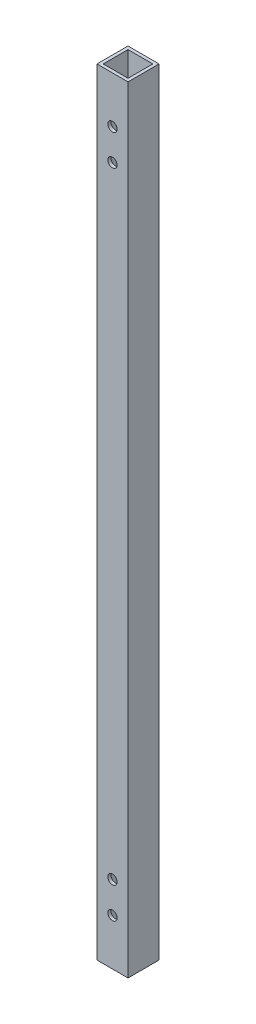
ISO-10303-21;
HEADER;
FILE_DESCRIPTION(('STEP AP214'),'2;1');
FILE_NAME('part.step','',(''),(''),'','','');
FILE_SCHEMA(('AUTOMOTIVE_DESIGN { 1 0 10303 214 1 1 1 1 }'));
ENDSEC;
DATA;
#1=APPLICATION_CONTEXT('core data for automotive mechanical design processes');
#2=APPLICATION_PROTOCOL_DEFINITION('international standard','automotive_design',2000,#1);
#3=PRODUCT_CONTEXT('',#1,'mechanical');
#4=PRODUCT('Part','Part','',(#3));
#5=PRODUCT_RELATED_PRODUCT_CATEGORY('part','',(#4));
#6=PRODUCT_DEFINITION_FORMATION('','',#4);
#7=PRODUCT_DEFINITION_CONTEXT('part definition',#1,'design');
#8=PRODUCT_DEFINITION('design','',#6,#7);
#9=PRODUCT_DEFINITION_SHAPE('','',#8);
#10=(LENGTH_UNIT() NAMED_UNIT(*) SI_UNIT(.MILLI.,.METRE.));
#11=(NAMED_UNIT(*) PLANE_ANGLE_UNIT() SI_UNIT($,.RADIAN.));
#12=(NAMED_UNIT(*) SI_UNIT($,.STERADIAN.) SOLID_ANGLE_UNIT());
#13=UNCERTAINTY_MEASURE_WITH_UNIT(LENGTH_MEASURE(1.E-05),#10,'distance_accuracy_value','');
#14=(GEOMETRIC_REPRESENTATION_CONTEXT(3) GLOBAL_UNCERTAINTY_ASSIGNED_CONTEXT((#13)) GLOBAL_UNIT_ASSIGNED_CONTEXT((#10,
#11,#12)) REPRESENTATION_CONTEXT('',''));
#15=CARTESIAN_POINT('',(0.,0.,0.));
#16=DIRECTION('',(0.,0.,1.));
#17=DIRECTION('',(1.,0.,0.));
#18=AXIS2_PLACEMENT_3D('',#15,#16,#17);
#19=CARTESIAN_POINT('',(-5.,250.,5.));
#20=DIRECTION('',(0.,0.,-1.));
#21=DIRECTION('',(-1.,0.,0.));
#22=AXIS2_PLACEMENT_3D('',#19,#20,#21);
#23=PLANE('',#22);
#24=DIRECTION('',(1.,0.,0.));
#25=VECTOR('',#24,1.);
#26=CARTESIAN_POINT('',(-5.,0.,5.));
#27=LINE('',#26,#25);
#28=CARTESIAN_POINT('',(-5.,0.,5.));
#29=VERTEX_POINT('',#28);
#30=CARTESIAN_POINT('',(5.,0.,5.));
#31=VERTEX_POINT('',#30);
#32=EDGE_CURVE('E143',#29,#31,#27,.T.);
#33=ORIENTED_EDGE('',*,*,#32,.T.);
#34=DIRECTION('',(0.,-1.,0.));
#35=VECTOR('',#34,1.);
#36=CARTESIAN_POINT('',(5.,250.,5.));
#37=LINE('',#36,#35);
#38=CARTESIAN_POINT('',(5.,250.,5.));
#39=VERTEX_POINT('',#38);
#40=EDGE_CURVE('E149',#39,#31,#37,.T.);
#41=ORIENTED_EDGE('',*,*,#40,.F.);
#42=DIRECTION('',(1.,0.,0.));
#43=VECTOR('',#42,1.);
#44=CARTESIAN_POINT('',(-5.,250.,5.));
#45=LINE('',#44,#43);
#46=CARTESIAN_POINT('',(-5.,250.,5.));
#47=VERTEX_POINT('',#46);
#48=EDGE_CURVE('E147',#47,#39,#45,.T.);
#49=ORIENTED_EDGE('',*,*,#48,.F.);
#50=DIRECTION('',(0.,-1.,0.));
#51=VECTOR('',#50,1.);
#52=CARTESIAN_POINT('',(-5.,250.,5.));
#53=LINE('',#52,#51);
#54=EDGE_CURVE('E159',#47,#29,#53,.T.);
#55=ORIENTED_EDGE('',*,*,#54,.T.);
#56=EDGE_LOOP('',(#33,#41,#49,#55));
#57=FACE_BOUND('',#56,.T.);
#58=CARTESIAN_POINT('',(0.,25.,5.));
#59=DIRECTION('',(0.,0.,1.));
#60=DIRECTION('',(1.,0.,0.));
#61=AXIS2_PLACEMENT_3D('',#58,#59,#60);
#62=CIRCLE('',#61,1.49999999999999);
#63=CARTESIAN_POINT('',(1.49999999999999,25.,5.));
#64=VERTEX_POINT('',#63);
#65=EDGE_CURVE('E197',#64,#64,#62,.T.);
#66=ORIENTED_EDGE('',*,*,#65,.F.);
#67=EDGE_LOOP('',(#66));
#68=FACE_BOUND('',#67,.T.);
#69=CARTESIAN_POINT('',(0.,15.,5.));
#70=DIRECTION('',(0.,0.,1.));
#71=DIRECTION('',(1.,0.,0.));
#72=AXIS2_PLACEMENT_3D('',#69,#70,#71);
#73=CIRCLE('',#72,1.49999999999999);
#74=CARTESIAN_POINT('',(1.49999999999999,15.,5.));
#75=VERTEX_POINT('',#74);
#76=EDGE_CURVE('E179',#75,#75,#73,.T.);
#77=ORIENTED_EDGE('',*,*,#76,.F.);
#78=EDGE_LOOP('',(#77));
#79=FACE_BOUND('',#78,.T.);
#80=CARTESIAN_POINT('',(0.,225.,5.));
#81=DIRECTION('',(0.,0.,1.));
#82=DIRECTION('',(1.,0.,0.));
#83=AXIS2_PLACEMENT_3D('',#80,#81,#82);
#84=CIRCLE('',#83,1.49999999999999);
#85=CARTESIAN_POINT('',(1.49999999999999,225.,5.));
#86=VERTEX_POINT('',#85);
#87=EDGE_CURVE('E182',#86,#86,#84,.T.);
#88=ORIENTED_EDGE('',*,*,#87,.F.);
#89=EDGE_LOOP('',(#88));
#90=FACE_BOUND('',#89,.T.);
#91=CARTESIAN_POINT('',(0.,235.,5.));
#92=DIRECTION('',(0.,0.,1.));
#93=DIRECTION('',(1.,0.,0.));
#94=AXIS2_PLACEMENT_3D('',#91,#92,#93);
#95=CIRCLE('',#94,1.49999999999999);
#96=CARTESIAN_POINT('',(1.49999999999999,235.,5.));
#97=VERTEX_POINT('',#96);
#98=EDGE_CURVE('E300',#97,#97,#95,.T.);
#99=ORIENTED_EDGE('',*,*,#98,.F.);
#100=EDGE_LOOP('',(#99));
#101=FACE_BOUND('',#100,.T.);
#102=ADVANCED_FACE('F33',(#57,#68,#79,#90,#101),#23,.F.);
#103=CARTESIAN_POINT('',(0.,250.,0.));
#104=DIRECTION('',(0.,1.,0.));
#105=DIRECTION('',(0.,0.,1.));
#106=AXIS2_PLACEMENT_3D('',#103,#104,#105);
#107=PLANE('',#106);
#108=DIRECTION('',(0.,0.,-1.));
#109=VECTOR('',#108,1.);
#110=CARTESIAN_POINT('',(5.,250.,-5.));
#111=LINE('',#110,#109);
#112=CARTESIAN_POINT('',(5.,250.,-5.));
#113=VERTEX_POINT('',#112);
#114=EDGE_CURVE('E139',#39,#113,#111,.T.);
#115=ORIENTED_EDGE('',*,*,#114,.T.);
#116=DIRECTION('',(-1.,0.,0.));
#117=VECTOR('',#116,1.);
#118=CARTESIAN_POINT('',(-5.,250.,-5.));
#119=LINE('',#118,#117);
#120=CARTESIAN_POINT('',(-5.,250.,-5.));
#121=VERTEX_POINT('',#120);
#122=EDGE_CURVE('E142',#113,#121,#119,.T.);
#123=ORIENTED_EDGE('',*,*,#122,.T.);
#124=DIRECTION('',(0.,0.,1.));
#125=VECTOR('',#124,1.);
#126=CARTESIAN_POINT('',(-5.,250.,-5.));
#127=LINE('',#126,#125);
#128=EDGE_CURVE('E145',#121,#47,#127,.T.);
#129=ORIENTED_EDGE('',*,*,#128,.T.);
#130=ORIENTED_EDGE('',*,*,#48,.T.);
#131=EDGE_LOOP('',(#115,#123,#129,#130));
#132=FACE_BOUND('',#131,.T.);
#133=DIRECTION('',(-1.,0.,0.));
#134=VECTOR('',#133,1.);
#135=CARTESIAN_POINT('',(-4.,250.,-4.));
#136=LINE('',#135,#134);
#137=CARTESIAN_POINT('',(4.,250.,-4.));
#138=VERTEX_POINT('',#137);
#139=CARTESIAN_POINT('',(-4.,250.,-4.));
#140=VERTEX_POINT('',#139);
#141=EDGE_CURVE('E108',#138,#140,#136,.T.);
#142=ORIENTED_EDGE('',*,*,#141,.F.);
#143=DIRECTION('',(0.,0.,-1.));
#144=VECTOR('',#143,1.);
#145=CARTESIAN_POINT('',(4.,250.,-4.));
#146=LINE('',#145,#144);
#147=CARTESIAN_POINT('',(4.,250.,4.));
#148=VERTEX_POINT('',#147);
#149=EDGE_CURVE('E100',#148,#138,#146,.T.);
#150=ORIENTED_EDGE('',*,*,#149,.F.);
#151=DIRECTION('',(1.,0.,0.));
#152=VECTOR('',#151,1.);
#153=CARTESIAN_POINT('',(-4.,250.,4.));
#154=LINE('',#153,#152);
#155=CARTESIAN_POINT('',(-4.,250.,4.));
#156=VERTEX_POINT('',#155);
#157=EDGE_CURVE('E123',#156,#148,#154,.T.);
#158=ORIENTED_EDGE('',*,*,#157,.F.);
#159=DIRECTION('',(0.,0.,1.));
#160=VECTOR('',#159,1.);
#161=CARTESIAN_POINT('',(-4.,250.,-4.));
#162=LINE('',#161,#160);
#163=EDGE_CURVE('E121',#140,#156,#162,.T.);
#164=ORIENTED_EDGE('',*,*,#163,.F.);
#165=EDGE_LOOP('',(#142,#150,#158,#164));
#166=FACE_BOUND('',#165,.T.);
#167=ADVANCED_FACE('F120',(#132,#166),#107,.T.);
#168=CARTESIAN_POINT('',(0.,0.,0.));
#169=DIRECTION('',(0.,1.,0.));
#170=DIRECTION('',(0.,0.,1.));
#171=AXIS2_PLACEMENT_3D('',#168,#169,#170);
#172=PLANE('',#171);
#173=DIRECTION('',(0.,0.,-1.));
#174=VECTOR('',#173,1.);
#175=CARTESIAN_POINT('',(5.,0.,-5.));
#176=LINE('',#175,#174);
#177=CARTESIAN_POINT('',(5.,0.,-5.));
#178=VERTEX_POINT('',#177);
#179=EDGE_CURVE('E116',#31,#178,#176,.T.);
#180=ORIENTED_EDGE('',*,*,#179,.F.);
#181=ORIENTED_EDGE('',*,*,#32,.F.);
#182=DIRECTION('',(0.,0.,1.));
#183=VECTOR('',#182,1.);
#184=CARTESIAN_POINT('',(-5.,0.,-5.));
#185=LINE('',#184,#183);
#186=CARTESIAN_POINT('',(-5.,0.,-5.));
#187=VERTEX_POINT('',#186);
#188=EDGE_CURVE('E154',#187,#29,#185,.T.);
#189=ORIENTED_EDGE('',*,*,#188,.F.);
#190=DIRECTION('',(-1.,0.,0.));
#191=VECTOR('',#190,1.);
#192=CARTESIAN_POINT('',(-5.,0.,-5.));
#193=LINE('',#192,#191);
#194=EDGE_CURVE('E152',#178,#187,#193,.T.);
#195=ORIENTED_EDGE('',*,*,#194,.F.);
#196=EDGE_LOOP('',(#180,#181,#189,#195));
#197=FACE_BOUND('',#196,.T.);
#198=DIRECTION('',(0.,0.,-1.));
#199=VECTOR('',#198,1.);
#200=CARTESIAN_POINT('',(4.,0.,-4.));
#201=LINE('',#200,#199);
#202=CARTESIAN_POINT('',(4.,0.,4.));
#203=VERTEX_POINT('',#202);
#204=CARTESIAN_POINT('',(4.,0.,-4.));
#205=VERTEX_POINT('',#204);
#206=EDGE_CURVE('E58',#203,#205,#201,.T.);
#207=ORIENTED_EDGE('',*,*,#206,.T.);
#208=DIRECTION('',(-1.,0.,0.));
#209=VECTOR('',#208,1.);
#210=CARTESIAN_POINT('',(-4.,0.,-4.));
#211=LINE('',#210,#209);
#212=CARTESIAN_POINT('',(-4.,0.,-4.));
#213=VERTEX_POINT('',#212);
#214=EDGE_CURVE('E115',#205,#213,#211,.T.);
#215=ORIENTED_EDGE('',*,*,#214,.T.);
#216=DIRECTION('',(0.,0.,1.));
#217=VECTOR('',#216,1.);
#218=CARTESIAN_POINT('',(-4.,0.,-4.));
#219=LINE('',#218,#217);
#220=CARTESIAN_POINT('',(-4.,0.,4.));
#221=VERTEX_POINT('',#220);
#222=EDGE_CURVE('E131',#213,#221,#219,.T.);
#223=ORIENTED_EDGE('',*,*,#222,.T.);
#224=DIRECTION('',(1.,0.,0.));
#225=VECTOR('',#224,1.);
#226=CARTESIAN_POINT('',(-4.,0.,4.));
#227=LINE('',#226,#225);
#228=EDGE_CURVE('E109',#221,#203,#227,.T.);
#229=ORIENTED_EDGE('',*,*,#228,.T.);
#230=EDGE_LOOP('',(#207,#215,#223,#229));
#231=FACE_BOUND('',#230,.T.);
#232=ADVANCED_FACE('F228',(#197,#231),#172,.F.);
#233=CARTESIAN_POINT('',(5.,250.,-5.));
#234=DIRECTION('',(-1.,0.,0.));
#235=DIRECTION('',(0.,0.,1.));
#236=AXIS2_PLACEMENT_3D('',#233,#234,#235);
#237=PLANE('',#236);
#238=ORIENTED_EDGE('',*,*,#179,.T.);
#239=DIRECTION('',(0.,-1.,0.));
#240=VECTOR('',#239,1.);
#241=CARTESIAN_POINT('',(5.,250.,-5.));
#242=LINE('',#241,#240);
#243=EDGE_CURVE('E11',#113,#178,#242,.T.);
#244=ORIENTED_EDGE('',*,*,#243,.F.);
#245=ORIENTED_EDGE('',*,*,#114,.F.);
#246=ORIENTED_EDGE('',*,*,#40,.T.);
#247=EDGE_LOOP('',(#238,#244,#245,#246));
#248=FACE_BOUND('',#247,.T.);
#249=ADVANCED_FACE('F35',(#248),#237,.F.);
#250=CARTESIAN_POINT('',(-5.,250.,-5.));
#251=DIRECTION('',(0.,0.,1.));
#252=DIRECTION('',(1.,0.,0.));
#253=AXIS2_PLACEMENT_3D('',#250,#251,#252);
#254=PLANE('',#253);
#255=CARTESIAN_POINT('',(0.,235.,-5.));
#256=DIRECTION('',(0.,0.,1.));
#257=DIRECTION('',(1.,0.,0.));
#258=AXIS2_PLACEMENT_3D('',#255,#256,#257);
#259=CIRCLE('',#258,1.5);
#260=CARTESIAN_POINT('',(1.5,235.,-5.));
#261=VERTEX_POINT('',#260);
#262=EDGE_CURVE('E245',#261,#261,#259,.T.);
#263=ORIENTED_EDGE('',*,*,#262,.T.);
#264=EDGE_LOOP('',(#263));
#265=FACE_BOUND('',#264,.T.);
#266=CARTESIAN_POINT('',(0.,225.,-5.));
#267=DIRECTION('',(0.,0.,1.));
#268=DIRECTION('',(1.,0.,0.));
#269=AXIS2_PLACEMENT_3D('',#266,#267,#268);
#270=CIRCLE('',#269,1.5);
#271=CARTESIAN_POINT('',(1.5,225.,-5.));
#272=VERTEX_POINT('',#271);
#273=EDGE_CURVE('E175',#272,#272,#270,.T.);
#274=ORIENTED_EDGE('',*,*,#273,.T.);
#275=EDGE_LOOP('',(#274));
#276=FACE_BOUND('',#275,.T.);
#277=CARTESIAN_POINT('',(0.,15.,-5.));
#278=DIRECTION('',(0.,0.,1.));
#279=DIRECTION('',(1.,0.,0.));
#280=AXIS2_PLACEMENT_3D('',#277,#278,#279);
#281=CIRCLE('',#280,1.5);
#282=CARTESIAN_POINT('',(1.5,15.,-5.));
#283=VERTEX_POINT('',#282);
#284=EDGE_CURVE('E171',#283,#283,#281,.T.);
#285=ORIENTED_EDGE('',*,*,#284,.T.);
#286=EDGE_LOOP('',(#285));
#287=FACE_BOUND('',#286,.T.);
#288=CARTESIAN_POINT('',(0.,25.,-5.));
#289=DIRECTION('',(0.,0.,1.));
#290=DIRECTION('',(1.,0.,0.));
#291=AXIS2_PLACEMENT_3D('',#288,#289,#290);
#292=CIRCLE('',#291,1.5);
#293=CARTESIAN_POINT('',(1.5,25.,-5.));
#294=VERTEX_POINT('',#293);
#295=EDGE_CURVE('E167',#294,#294,#292,.T.);
#296=ORIENTED_EDGE('',*,*,#295,.T.);
#297=EDGE_LOOP('',(#296));
#298=FACE_BOUND('',#297,.T.);
#299=ORIENTED_EDGE('',*,*,#194,.T.);
#300=DIRECTION('',(0.,-1.,0.));
#301=VECTOR('',#300,1.);
#302=CARTESIAN_POINT('',(-5.,250.,-5.));
#303=LINE('',#302,#301);
#304=EDGE_CURVE('E42',#121,#187,#303,.T.);
#305=ORIENTED_EDGE('',*,*,#304,.F.);
#306=ORIENTED_EDGE('',*,*,#122,.F.);
#307=ORIENTED_EDGE('',*,*,#243,.T.);
#308=EDGE_LOOP('',(#299,#305,#306,#307));
#309=FACE_BOUND('',#308,.T.);
#310=ADVANCED_FACE('F235',(#265,#276,#287,#298,#309),#254,.F.);
#311=CARTESIAN_POINT('',(-5.,250.,-5.));
#312=DIRECTION('',(1.,0.,0.));
#313=DIRECTION('',(0.,0.,-1.));
#314=AXIS2_PLACEMENT_3D('',#311,#312,#313);
#315=PLANE('',#314);
#316=ORIENTED_EDGE('',*,*,#188,.T.);
#317=ORIENTED_EDGE('',*,*,#54,.F.);
#318=ORIENTED_EDGE('',*,*,#128,.F.);
#319=ORIENTED_EDGE('',*,*,#304,.T.);
#320=EDGE_LOOP('',(#316,#317,#318,#319));
#321=FACE_BOUND('',#320,.T.);
#322=ADVANCED_FACE('F218',(#321),#315,.F.);
#323=CARTESIAN_POINT('',(4.,250.,-4.));
#324=DIRECTION('',(-1.,0.,0.));
#325=DIRECTION('',(0.,0.,1.));
#326=AXIS2_PLACEMENT_3D('',#323,#324,#325);
#327=PLANE('',#326);
#328=ORIENTED_EDGE('',*,*,#206,.F.);
#329=DIRECTION('',(0.,-1.,0.));
#330=VECTOR('',#329,1.);
#331=CARTESIAN_POINT('',(4.,250.,4.));
#332=LINE('',#331,#330);
#333=EDGE_CURVE('E104',#148,#203,#332,.T.);
#334=ORIENTED_EDGE('',*,*,#333,.F.);
#335=ORIENTED_EDGE('',*,*,#149,.T.);
#336=DIRECTION('',(0.,-1.,0.));
#337=VECTOR('',#336,1.);
#338=CARTESIAN_POINT('',(4.,250.,-4.));
#339=LINE('',#338,#337);
#340=EDGE_CURVE('E103',#138,#205,#339,.T.);
#341=ORIENTED_EDGE('',*,*,#340,.T.);
#342=EDGE_LOOP('',(#328,#334,#335,#341));
#343=FACE_BOUND('',#342,.T.);
#344=ADVANCED_FACE('F102',(#343),#327,.T.);
#345=CARTESIAN_POINT('',(-4.,250.,-4.));
#346=DIRECTION('',(0.,0.,1.));
#347=DIRECTION('',(1.,0.,0.));
#348=AXIS2_PLACEMENT_3D('',#345,#346,#347);
#349=PLANE('',#348);
#350=CARTESIAN_POINT('',(0.,235.,-4.));
#351=DIRECTION('',(0.,0.,1.));
#352=DIRECTION('',(1.,0.,0.));
#353=AXIS2_PLACEMENT_3D('',#350,#351,#352);
#354=CIRCLE('',#353,1.49999999999999);
#355=CARTESIAN_POINT('',(1.49999999999999,235.,-4.));
#356=VERTEX_POINT('',#355);
#357=EDGE_CURVE('E187',#356,#356,#354,.T.);
#358=ORIENTED_EDGE('',*,*,#357,.F.);
#359=EDGE_LOOP('',(#358));
#360=FACE_BOUND('',#359,.T.);
#361=CARTESIAN_POINT('',(0.,225.,-4.));
#362=DIRECTION('',(0.,0.,1.));
#363=DIRECTION('',(1.,0.,0.));
#364=AXIS2_PLACEMENT_3D('',#361,#362,#363);
#365=CIRCLE('',#364,1.49999999999999);
#366=CARTESIAN_POINT('',(1.49999999999999,225.,-4.));
#367=VERTEX_POINT('',#366);
#368=EDGE_CURVE('E174',#367,#367,#365,.T.);
#369=ORIENTED_EDGE('',*,*,#368,.F.);
#370=EDGE_LOOP('',(#369));
#371=FACE_BOUND('',#370,.T.);
#372=CARTESIAN_POINT('',(0.,15.,-4.));
#373=DIRECTION('',(0.,0.,1.));
#374=DIRECTION('',(1.,0.,0.));
#375=AXIS2_PLACEMENT_3D('',#372,#373,#374);
#376=CIRCLE('',#375,1.49999999999999);
#377=CARTESIAN_POINT('',(1.49999999999999,15.,-4.));
#378=VERTEX_POINT('',#377);
#379=EDGE_CURVE('E170',#378,#378,#376,.T.);
#380=ORIENTED_EDGE('',*,*,#379,.F.);
#381=EDGE_LOOP('',(#380));
#382=FACE_BOUND('',#381,.T.);
#383=CARTESIAN_POINT('',(0.,25.,-4.));
#384=DIRECTION('',(0.,0.,1.));
#385=DIRECTION('',(1.,0.,0.));
#386=AXIS2_PLACEMENT_3D('',#383,#384,#385);
#387=CIRCLE('',#386,1.49999999999999);
#388=CARTESIAN_POINT('',(1.49999999999999,25.,-4.));
#389=VERTEX_POINT('',#388);
#390=EDGE_CURVE('E129',#389,#389,#387,.T.);
#391=ORIENTED_EDGE('',*,*,#390,.F.);
#392=EDGE_LOOP('',(#391));
#393=FACE_BOUND('',#392,.T.);
#394=ORIENTED_EDGE('',*,*,#214,.F.);
#395=ORIENTED_EDGE('',*,*,#340,.F.);
#396=ORIENTED_EDGE('',*,*,#141,.T.);
#397=DIRECTION('',(0.,-1.,0.));
#398=VECTOR('',#397,1.);
#399=CARTESIAN_POINT('',(-4.,250.,-4.));
#400=LINE('',#399,#398);
#401=EDGE_CURVE('E117',#140,#213,#400,.T.);
#402=ORIENTED_EDGE('',*,*,#401,.T.);
#403=EDGE_LOOP('',(#394,#395,#396,#402));
#404=FACE_BOUND('',#403,.T.);
#405=ADVANCED_FACE('F112',(#360,#371,#382,#393,#404),#349,.T.);
#406=CARTESIAN_POINT('',(-4.,250.,-4.));
#407=DIRECTION('',(1.,0.,0.));
#408=DIRECTION('',(0.,0.,-1.));
#409=AXIS2_PLACEMENT_3D('',#406,#407,#408);
#410=PLANE('',#409);
#411=ORIENTED_EDGE('',*,*,#222,.F.);
#412=ORIENTED_EDGE('',*,*,#401,.F.);
#413=ORIENTED_EDGE('',*,*,#163,.T.);
#414=DIRECTION('',(0.,-1.,0.));
#415=VECTOR('',#414,1.);
#416=CARTESIAN_POINT('',(-4.,250.,4.));
#417=LINE('',#416,#415);
#418=EDGE_CURVE('E50',#156,#221,#417,.T.);
#419=ORIENTED_EDGE('',*,*,#418,.T.);
#420=EDGE_LOOP('',(#411,#412,#413,#419));
#421=FACE_BOUND('',#420,.T.);
#422=ADVANCED_FACE('F208',(#421),#410,.T.);
#423=CARTESIAN_POINT('',(-4.,250.,4.));
#424=DIRECTION('',(0.,0.,-1.));
#425=DIRECTION('',(-1.,0.,0.));
#426=AXIS2_PLACEMENT_3D('',#423,#424,#425);
#427=PLANE('',#426);
#428=CARTESIAN_POINT('',(0.,235.,4.));
#429=DIRECTION('',(0.,0.,-1.));
#430=DIRECTION('',(-1.,0.,0.));
#431=AXIS2_PLACEMENT_3D('',#428,#429,#430);
#432=CIRCLE('',#431,1.49999999999999);
#433=CARTESIAN_POINT('',(-1.49999999999999,235.,4.));
#434=VERTEX_POINT('',#433);
#435=EDGE_CURVE('E37',#434,#434,#432,.T.);
#436=ORIENTED_EDGE('',*,*,#435,.F.);
#437=EDGE_LOOP('',(#436));
#438=FACE_BOUND('',#437,.T.);
#439=CARTESIAN_POINT('',(0.,225.,4.));
#440=DIRECTION('',(0.,0.,-1.));
#441=DIRECTION('',(-1.,0.,0.));
#442=AXIS2_PLACEMENT_3D('',#439,#440,#441);
#443=CIRCLE('',#442,1.49999999999999);
#444=CARTESIAN_POINT('',(-1.49999999999999,225.,4.));
#445=VERTEX_POINT('',#444);
#446=EDGE_CURVE('E172',#445,#445,#443,.T.);
#447=ORIENTED_EDGE('',*,*,#446,.F.);
#448=EDGE_LOOP('',(#447));
#449=FACE_BOUND('',#448,.T.);
#450=CARTESIAN_POINT('',(0.,15.,4.));
#451=DIRECTION('',(0.,0.,-1.));
#452=DIRECTION('',(-1.,0.,0.));
#453=AXIS2_PLACEMENT_3D('',#450,#451,#452);
#454=CIRCLE('',#453,1.49999999999999);
#455=CARTESIAN_POINT('',(-1.49999999999999,15.,4.));
#456=VERTEX_POINT('',#455);
#457=EDGE_CURVE('E168',#456,#456,#454,.T.);
#458=ORIENTED_EDGE('',*,*,#457,.F.);
#459=EDGE_LOOP('',(#458));
#460=FACE_BOUND('',#459,.T.);
#461=CARTESIAN_POINT('',(0.,25.,4.));
#462=DIRECTION('',(0.,0.,-1.));
#463=DIRECTION('',(-1.,0.,0.));
#464=AXIS2_PLACEMENT_3D('',#461,#462,#463);
#465=CIRCLE('',#464,1.49999999999999);
#466=CARTESIAN_POINT('',(-1.49999999999999,25.,4.));
#467=VERTEX_POINT('',#466);
#468=EDGE_CURVE('E164',#467,#467,#465,.T.);
#469=ORIENTED_EDGE('',*,*,#468,.F.);
#470=EDGE_LOOP('',(#469));
#471=FACE_BOUND('',#470,.T.);
#472=ORIENTED_EDGE('',*,*,#228,.F.);
#473=ORIENTED_EDGE('',*,*,#418,.F.);
#474=ORIENTED_EDGE('',*,*,#157,.T.);
#475=ORIENTED_EDGE('',*,*,#333,.T.);
#476=EDGE_LOOP('',(#472,#473,#474,#475));
#477=FACE_BOUND('',#476,.T.);
#478=ADVANCED_FACE('F215',(#438,#449,#460,#471,#477),#427,.T.);
#479=CARTESIAN_POINT('',(0.,25.,5.));
#480=DIRECTION('',(0.,0.,1.));
#481=DIRECTION('',(1.,0.,0.));
#482=AXIS2_PLACEMENT_3D('',#479,#480,#481);
#483=CYLINDRICAL_SURFACE('',#482,1.49999999999999);
#484=ORIENTED_EDGE('',*,*,#468,.T.);
#485=EDGE_LOOP('',(#484));
#486=FACE_BOUND('',#485,.T.);
#487=ORIENTED_EDGE('',*,*,#65,.T.);
#488=EDGE_LOOP('',(#487));
#489=FACE_BOUND('',#488,.T.);
#490=ADVANCED_FACE('F266',(#486,#489),#483,.F.);
#491=ORIENTED_EDGE('',*,*,#390,.T.);
#492=EDGE_LOOP('',(#491));
#493=FACE_BOUND('',#492,.T.);
#494=ORIENTED_EDGE('',*,*,#295,.F.);
#495=EDGE_LOOP('',(#494));
#496=FACE_BOUND('',#495,.T.);
#497=ADVANCED_FACE('F204',(#493,#496),#483,.F.);
#498=CARTESIAN_POINT('',(0.,15.,5.));
#499=DIRECTION('',(0.,0.,1.));
#500=DIRECTION('',(1.,0.,0.));
#501=AXIS2_PLACEMENT_3D('',#498,#499,#500);
#502=CYLINDRICAL_SURFACE('',#501,1.49999999999999);
#503=ORIENTED_EDGE('',*,*,#457,.T.);
#504=EDGE_LOOP('',(#503));
#505=FACE_BOUND('',#504,.T.);
#506=ORIENTED_EDGE('',*,*,#76,.T.);
#507=EDGE_LOOP('',(#506));
#508=FACE_BOUND('',#507,.T.);
#509=ADVANCED_FACE('F277',(#505,#508),#502,.F.);
#510=ORIENTED_EDGE('',*,*,#379,.T.);
#511=EDGE_LOOP('',(#510));
#512=FACE_BOUND('',#511,.T.);
#513=ORIENTED_EDGE('',*,*,#284,.F.);
#514=EDGE_LOOP('',(#513));
#515=FACE_BOUND('',#514,.T.);
#516=ADVANCED_FACE('F280',(#512,#515),#502,.F.);
#517=CARTESIAN_POINT('',(0.,225.,5.));
#518=DIRECTION('',(0.,0.,1.));
#519=DIRECTION('',(1.,0.,0.));
#520=AXIS2_PLACEMENT_3D('',#517,#518,#519);
#521=CYLINDRICAL_SURFACE('',#520,1.49999999999999);
#522=ORIENTED_EDGE('',*,*,#446,.T.);
#523=EDGE_LOOP('',(#522));
#524=FACE_BOUND('',#523,.T.);
#525=ORIENTED_EDGE('',*,*,#87,.T.);
#526=EDGE_LOOP('',(#525));
#527=FACE_BOUND('',#526,.T.);
#528=ADVANCED_FACE('F282',(#524,#527),#521,.F.);
#529=ORIENTED_EDGE('',*,*,#368,.T.);
#530=EDGE_LOOP('',(#529));
#531=FACE_BOUND('',#530,.T.);
#532=ORIENTED_EDGE('',*,*,#273,.F.);
#533=EDGE_LOOP('',(#532));
#534=FACE_BOUND('',#533,.T.);
#535=ADVANCED_FACE('F285',(#531,#534),#521,.F.);
#536=CARTESIAN_POINT('',(0.,235.,5.));
#537=DIRECTION('',(0.,0.,1.));
#538=DIRECTION('',(1.,0.,0.));
#539=AXIS2_PLACEMENT_3D('',#536,#537,#538);
#540=CYLINDRICAL_SURFACE('',#539,1.49999999999999);
#541=ORIENTED_EDGE('',*,*,#435,.T.);
#542=EDGE_LOOP('',(#541));
#543=FACE_BOUND('',#542,.T.);
#544=ORIENTED_EDGE('',*,*,#98,.T.);
#545=EDGE_LOOP('',(#544));
#546=FACE_BOUND('',#545,.T.);
#547=ADVANCED_FACE('F286',(#543,#546),#540,.F.);
#548=ORIENTED_EDGE('',*,*,#357,.T.);
#549=EDGE_LOOP('',(#548));
#550=FACE_BOUND('',#549,.T.);
#551=ORIENTED_EDGE('',*,*,#262,.F.);
#552=EDGE_LOOP('',(#551));
#553=FACE_BOUND('',#552,.T.);
#554=ADVANCED_FACE('F288',(#550,#553),#540,.F.);
#555=CLOSED_SHELL('',(#102,#167,#232,#249,#310,#322,#344,#405,#422,#478,#490,#497,#509,#516,
#528,#535,#547,#554));
#556=MANIFOLD_SOLID_BREP('B2',#555);
#557=ADVANCED_BREP_SHAPE_REPRESENTATION('',(#18,#556),#14);
#558=SHAPE_DEFINITION_REPRESENTATION(#9,#557);
ENDSEC;
END-ISO-10303-21;
